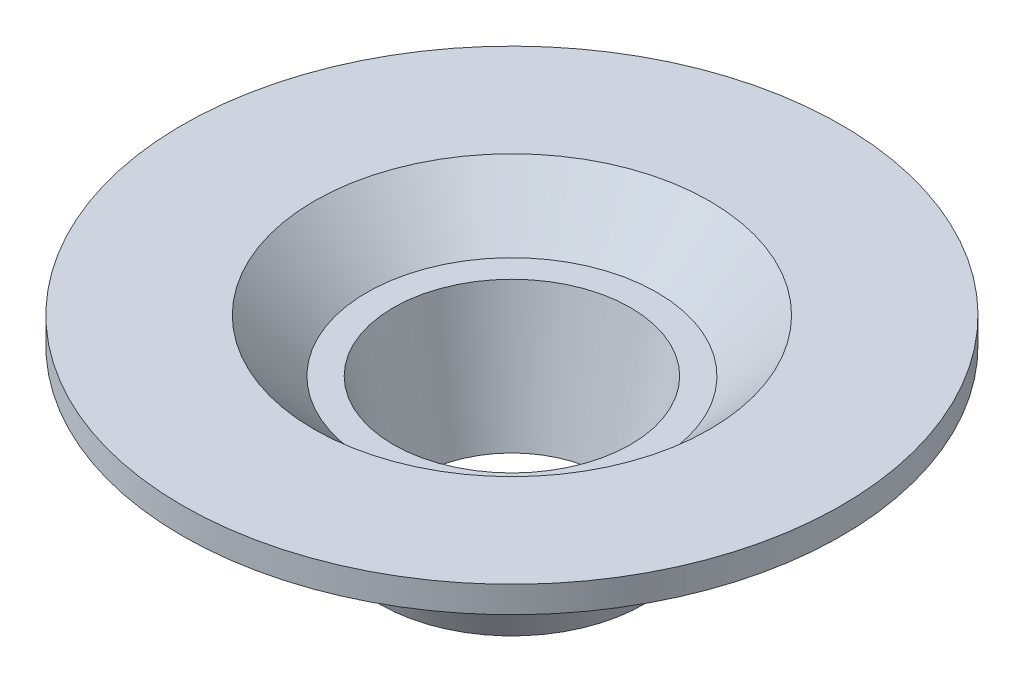
ISO-10303-21;
HEADER;
FILE_DESCRIPTION(('STEP AP214'),'2;1');
FILE_NAME('part.step','',(''),(''),'','','');
FILE_SCHEMA(('AUTOMOTIVE_DESIGN { 1 0 10303 214 1 1 1 1 }'));
ENDSEC;
DATA;
#1=APPLICATION_CONTEXT('core data for automotive mechanical design processes');
#2=APPLICATION_PROTOCOL_DEFINITION('international standard','automotive_design',2000,#1);
#3=PRODUCT_CONTEXT('',#1,'mechanical');
#4=PRODUCT('Part','Part','',(#3));
#5=PRODUCT_RELATED_PRODUCT_CATEGORY('part','',(#4));
#6=PRODUCT_DEFINITION_FORMATION('','',#4);
#7=PRODUCT_DEFINITION_CONTEXT('part definition',#1,'design');
#8=PRODUCT_DEFINITION('design','',#6,#7);
#9=PRODUCT_DEFINITION_SHAPE('','',#8);
#10=(LENGTH_UNIT() NAMED_UNIT(*) SI_UNIT(.MILLI.,.METRE.));
#11=(NAMED_UNIT(*) PLANE_ANGLE_UNIT() SI_UNIT($,.RADIAN.));
#12=(NAMED_UNIT(*) SI_UNIT($,.STERADIAN.) SOLID_ANGLE_UNIT());
#13=UNCERTAINTY_MEASURE_WITH_UNIT(LENGTH_MEASURE(1.E-05),#10,'distance_accuracy_value','');
#14=(GEOMETRIC_REPRESENTATION_CONTEXT(3) GLOBAL_UNCERTAINTY_ASSIGNED_CONTEXT((#13)) GLOBAL_UNIT_ASSIGNED_CONTEXT((#10,
#11,#12)) REPRESENTATION_CONTEXT('',''));
#15=CARTESIAN_POINT('',(0.,0.,0.));
#16=DIRECTION('',(0.,0.,1.));
#17=DIRECTION('',(1.,0.,0.));
#18=AXIS2_PLACEMENT_3D('',#15,#16,#17);
#19=CARTESIAN_POINT('',(0.,-5.,-5.));
#20=DIRECTION('',(0.,1.,0.));
#21=DIRECTION('',(0.,0.,1.));
#22=AXIS2_PLACEMENT_3D('',#19,#20,#21);
#23=PLANE('',#22);
#24=CARTESIAN_POINT('',(0.,-5.,0.));
#25=DIRECTION('',(0.,1.,0.));
#26=DIRECTION('',(0.,0.,1.));
#27=AXIS2_PLACEMENT_3D('',#24,#25,#26);
#28=CIRCLE('',#27,5.);
#29=CARTESIAN_POINT('',(0.,-5.,5.));
#30=VERTEX_POINT('',#29);
#31=EDGE_CURVE('E10',#30,#30,#28,.T.);
#32=ORIENTED_EDGE('',*,*,#31,.F.);
#33=EDGE_LOOP('',(#32));
#34=FACE_BOUND('',#33,.T.);
#35=CARTESIAN_POINT('',(0.,-5.,0.));
#36=DIRECTION('',(0.,1.,0.));
#37=DIRECTION('',(0.,0.,1.));
#38=AXIS2_PLACEMENT_3D('',#35,#36,#37);
#39=CIRCLE('',#38,3.5);
#40=CARTESIAN_POINT('',(0.,-5.,3.5));
#41=VERTEX_POINT('',#40);
#42=EDGE_CURVE('E84',#41,#41,#39,.T.);
#43=ORIENTED_EDGE('',*,*,#42,.T.);
#44=EDGE_LOOP('',(#43));
#45=FACE_BOUND('',#44,.T.);
#46=ADVANCED_FACE('F41',(#34,#45),#23,.F.);
#47=CARTESIAN_POINT('',(0.,-5.,0.));
#48=DIRECTION('',(0.,1.,0.));
#49=DIRECTION('',(0.,0.,1.));
#50=AXIS2_PLACEMENT_3D('',#47,#48,#49);
#51=CONICAL_SURFACE('',#50,5.,0.358770670270572);
#52=CARTESIAN_POINT('',(0.,-0.999999999999999,0.));
#53=DIRECTION('',(0.,1.,0.));
#54=DIRECTION('',(0.,0.,1.));
#55=AXIS2_PLACEMENT_3D('',#52,#53,#54);
#56=CIRCLE('',#55,6.5);
#57=CARTESIAN_POINT('',(0.,-0.999999999999999,6.5));
#58=VERTEX_POINT('',#57);
#59=EDGE_CURVE('E48',#58,#58,#56,.T.);
#60=ORIENTED_EDGE('',*,*,#59,.F.);
#61=EDGE_LOOP('',(#60));
#62=FACE_BOUND('',#61,.T.);
#63=ORIENTED_EDGE('',*,*,#31,.T.);
#64=EDGE_LOOP('',(#63));
#65=FACE_BOUND('',#64,.T.);
#66=ADVANCED_FACE('F134',(#62,#65),#51,.T.);
#67=CARTESIAN_POINT('',(0.,-0.999999999999999,-8.5));
#68=DIRECTION('',(0.,1.,0.));
#69=DIRECTION('',(0.,0.,1.));
#70=AXIS2_PLACEMENT_3D('',#67,#68,#69);
#71=PLANE('',#70);
#72=CARTESIAN_POINT('',(0.,-0.999999999999998,0.));
#73=DIRECTION('',(0.,1.,0.));
#74=DIRECTION('',(0.,0.,1.));
#75=AXIS2_PLACEMENT_3D('',#72,#73,#74);
#76=CIRCLE('',#75,8.5);
#77=CARTESIAN_POINT('',(0.,-0.999999999999998,8.5));
#78=VERTEX_POINT('',#77);
#79=EDGE_CURVE('E53',#78,#78,#76,.T.);
#80=ORIENTED_EDGE('',*,*,#79,.F.);
#81=EDGE_LOOP('',(#80));
#82=FACE_BOUND('',#81,.T.);
#83=ORIENTED_EDGE('',*,*,#59,.T.);
#84=EDGE_LOOP('',(#83));
#85=FACE_BOUND('',#84,.T.);
#86=ADVANCED_FACE('F129',(#82,#85),#71,.F.);
#87=CARTESIAN_POINT('',(0.,-0.999999999999998,0.));
#88=DIRECTION('',(0.,1.,0.));
#89=DIRECTION('',(0.,0.,1.));
#90=AXIS2_PLACEMENT_3D('',#87,#88,#89);
#91=CONICAL_SURFACE('',#90,8.5,0.785398163397448);
#92=CARTESIAN_POINT('',(0.,1.,0.));
#93=DIRECTION('',(0.,1.,0.));
#94=DIRECTION('',(0.,0.,1.));
#95=AXIS2_PLACEMENT_3D('',#92,#93,#94);
#96=CIRCLE('',#95,10.5);
#97=CARTESIAN_POINT('',(0.,1.,10.5));
#98=VERTEX_POINT('',#97);
#99=EDGE_CURVE('E58',#98,#98,#96,.T.);
#100=ORIENTED_EDGE('',*,*,#99,.F.);
#101=EDGE_LOOP('',(#100));
#102=FACE_BOUND('',#101,.T.);
#103=ORIENTED_EDGE('',*,*,#79,.T.);
#104=EDGE_LOOP('',(#103));
#105=FACE_BOUND('',#104,.T.);
#106=ADVANCED_FACE('F123',(#102,#105),#91,.T.);
#107=CARTESIAN_POINT('',(0.,1.,-12.5));
#108=DIRECTION('',(0.,1.,0.));
#109=DIRECTION('',(0.,0.,1.));
#110=AXIS2_PLACEMENT_3D('',#107,#108,#109);
#111=PLANE('',#110);
#112=CARTESIAN_POINT('',(0.,1.,0.));
#113=DIRECTION('',(0.,1.,0.));
#114=DIRECTION('',(0.,0.,1.));
#115=AXIS2_PLACEMENT_3D('',#112,#113,#114);
#116=CIRCLE('',#115,12.5);
#117=CARTESIAN_POINT('',(0.,1.,12.5));
#118=VERTEX_POINT('',#117);
#119=EDGE_CURVE('E64',#118,#118,#116,.T.);
#120=ORIENTED_EDGE('',*,*,#119,.F.);
#121=EDGE_LOOP('',(#120));
#122=FACE_BOUND('',#121,.T.);
#123=ORIENTED_EDGE('',*,*,#99,.T.);
#124=EDGE_LOOP('',(#123));
#125=FACE_BOUND('',#124,.T.);
#126=ADVANCED_FACE('F117',(#122,#125),#111,.F.);
#127=CARTESIAN_POINT('',(0.,0.,0.));
#128=DIRECTION('',(0.,1.,0.));
#129=DIRECTION('',(0.,0.,1.));
#130=AXIS2_PLACEMENT_3D('',#127,#128,#129);
#131=CYLINDRICAL_SURFACE('',#130,12.5);
#132=CARTESIAN_POINT('',(0.,2.,0.));
#133=DIRECTION('',(0.,1.,0.));
#134=DIRECTION('',(0.,0.,1.));
#135=AXIS2_PLACEMENT_3D('',#132,#133,#134);
#136=CIRCLE('',#135,12.5);
#137=CARTESIAN_POINT('',(0.,2.,12.5));
#138=VERTEX_POINT('',#137);
#139=EDGE_CURVE('E68',#138,#138,#136,.T.);
#140=ORIENTED_EDGE('',*,*,#139,.F.);
#141=EDGE_LOOP('',(#140));
#142=FACE_BOUND('',#141,.T.);
#143=ORIENTED_EDGE('',*,*,#119,.T.);
#144=EDGE_LOOP('',(#143));
#145=FACE_BOUND('',#144,.T.);
#146=ADVANCED_FACE('F111',(#142,#145),#131,.T.);
#147=CARTESIAN_POINT('',(0.,2.,-7.5));
#148=DIRECTION('',(0.,-1.,0.));
#149=DIRECTION('',(0.,0.,-1.));
#150=AXIS2_PLACEMENT_3D('',#147,#148,#149);
#151=PLANE('',#150);
#152=CARTESIAN_POINT('',(0.,2.,0.));
#153=DIRECTION('',(0.,1.,0.));
#154=DIRECTION('',(0.,0.,1.));
#155=AXIS2_PLACEMENT_3D('',#152,#153,#154);
#156=CIRCLE('',#155,7.5);
#157=CARTESIAN_POINT('',(0.,2.,7.5));
#158=VERTEX_POINT('',#157);
#159=EDGE_CURVE('E72',#158,#158,#156,.T.);
#160=ORIENTED_EDGE('',*,*,#159,.F.);
#161=EDGE_LOOP('',(#160));
#162=FACE_BOUND('',#161,.T.);
#163=ORIENTED_EDGE('',*,*,#139,.T.);
#164=EDGE_LOOP('',(#163));
#165=FACE_BOUND('',#164,.T.);
#166=ADVANCED_FACE('F105',(#162,#165),#151,.F.);
#167=CARTESIAN_POINT('',(0.,2.,0.));
#168=DIRECTION('',(0.,1.,0.));
#169=DIRECTION('',(0.,0.,1.));
#170=AXIS2_PLACEMENT_3D('',#167,#168,#169);
#171=CONICAL_SURFACE('',#170,7.5,0.785398163397448);
#172=CARTESIAN_POINT('',(0.,0.,0.));
#173=DIRECTION('',(0.,1.,0.));
#174=DIRECTION('',(0.,0.,1.));
#175=AXIS2_PLACEMENT_3D('',#172,#173,#174);
#176=CIRCLE('',#175,5.5);
#177=CARTESIAN_POINT('',(0.,0.,5.5));
#178=VERTEX_POINT('',#177);
#179=EDGE_CURVE('E76',#178,#178,#176,.T.);
#180=ORIENTED_EDGE('',*,*,#179,.F.);
#181=EDGE_LOOP('',(#180));
#182=FACE_BOUND('',#181,.T.);
#183=ORIENTED_EDGE('',*,*,#159,.T.);
#184=EDGE_LOOP('',(#183));
#185=FACE_BOUND('',#184,.T.);
#186=ADVANCED_FACE('F99',(#182,#185),#171,.F.);
#187=CARTESIAN_POINT('',(0.,0.,-4.5));
#188=DIRECTION('',(0.,-1.,0.));
#189=DIRECTION('',(0.,0.,-1.));
#190=AXIS2_PLACEMENT_3D('',#187,#188,#189);
#191=PLANE('',#190);
#192=CARTESIAN_POINT('',(0.,0.,0.));
#193=DIRECTION('',(0.,1.,0.));
#194=DIRECTION('',(0.,0.,1.));
#195=AXIS2_PLACEMENT_3D('',#192,#193,#194);
#196=CIRCLE('',#195,4.5);
#197=CARTESIAN_POINT('',(0.,0.,4.5));
#198=VERTEX_POINT('',#197);
#199=EDGE_CURVE('E80',#198,#198,#196,.T.);
#200=ORIENTED_EDGE('',*,*,#199,.F.);
#201=EDGE_LOOP('',(#200));
#202=FACE_BOUND('',#201,.T.);
#203=ORIENTED_EDGE('',*,*,#179,.T.);
#204=EDGE_LOOP('',(#203));
#205=FACE_BOUND('',#204,.T.);
#206=ADVANCED_FACE('F93',(#202,#205),#191,.F.);
#207=CARTESIAN_POINT('',(0.,0.,0.));
#208=DIRECTION('',(0.,1.,0.));
#209=DIRECTION('',(0.,0.,1.));
#210=AXIS2_PLACEMENT_3D('',#207,#208,#209);
#211=CONICAL_SURFACE('',#210,4.5,0.197395559849881);
#212=ORIENTED_EDGE('',*,*,#42,.F.);
#213=EDGE_LOOP('',(#212));
#214=FACE_BOUND('',#213,.T.);
#215=ORIENTED_EDGE('',*,*,#199,.T.);
#216=EDGE_LOOP('',(#215));
#217=FACE_BOUND('',#216,.T.);
#218=ADVANCED_FACE('F90',(#214,#217),#211,.F.);
#219=CLOSED_SHELL('',(#46,#66,#86,#106,#126,#146,#166,#186,#206,#218));
#220=MANIFOLD_SOLID_BREP('B2',#219);
#221=ADVANCED_BREP_SHAPE_REPRESENTATION('',(#18,#220),#14);
#222=SHAPE_DEFINITION_REPRESENTATION(#9,#221);
ENDSEC;
END-ISO-10303-21;
